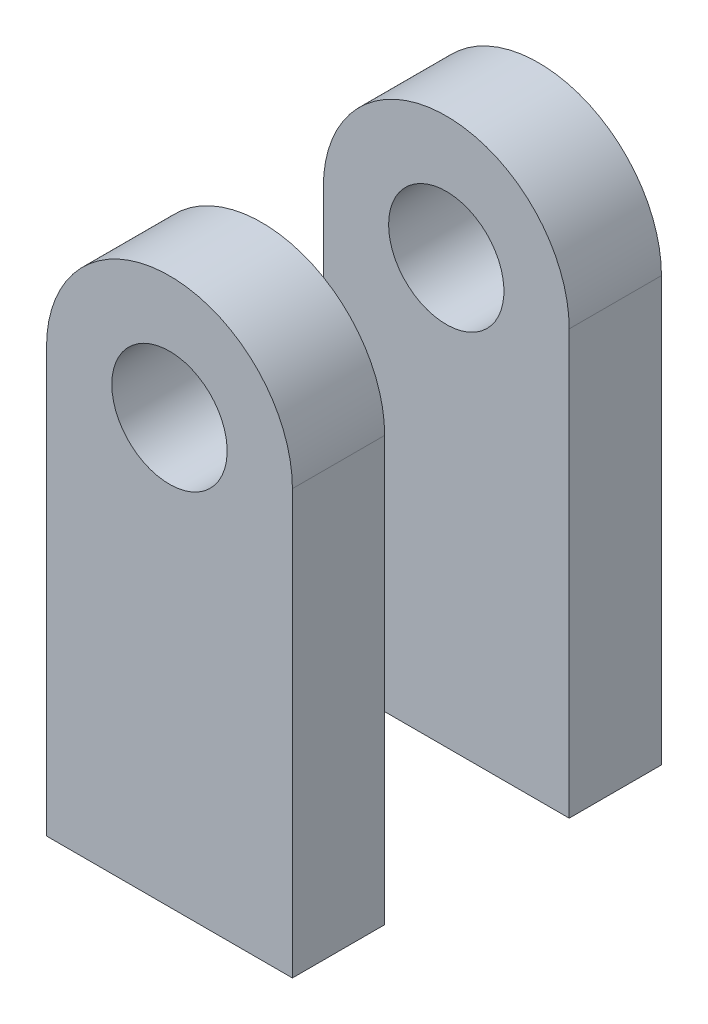
ISO-10303-21;
HEADER;
FILE_DESCRIPTION(('STEP AP214'),'2;1');
FILE_NAME('part.step','',(''),(''),'','','');
FILE_SCHEMA(('AUTOMOTIVE_DESIGN { 1 0 10303 214 1 1 1 1 }'));
ENDSEC;
DATA;
#1=APPLICATION_CONTEXT('core data for automotive mechanical design processes');
#2=APPLICATION_PROTOCOL_DEFINITION('international standard','automotive_design',2000,#1);
#3=PRODUCT_CONTEXT('',#1,'mechanical');
#4=PRODUCT('Part','Part','',(#3));
#5=PRODUCT_RELATED_PRODUCT_CATEGORY('part','',(#4));
#6=PRODUCT_DEFINITION_FORMATION('','',#4);
#7=PRODUCT_DEFINITION_CONTEXT('part definition',#1,'design');
#8=PRODUCT_DEFINITION('design','',#6,#7);
#9=PRODUCT_DEFINITION_SHAPE('','',#8);
#10=(LENGTH_UNIT() NAMED_UNIT(*) SI_UNIT(.MILLI.,.METRE.));
#11=(NAMED_UNIT(*) PLANE_ANGLE_UNIT() SI_UNIT($,.RADIAN.));
#12=(NAMED_UNIT(*) SI_UNIT($,.STERADIAN.) SOLID_ANGLE_UNIT());
#13=UNCERTAINTY_MEASURE_WITH_UNIT(LENGTH_MEASURE(1.E-05),#10,'distance_accuracy_value','');
#14=(GEOMETRIC_REPRESENTATION_CONTEXT(3) GLOBAL_UNCERTAINTY_ASSIGNED_CONTEXT((#13)) GLOBAL_UNIT_ASSIGNED_CONTEXT((#10,
#11,#12)) REPRESENTATION_CONTEXT('',''));
#15=CARTESIAN_POINT('',(0.,0.,0.));
#16=DIRECTION('',(0.,0.,1.));
#17=DIRECTION('',(1.,0.,0.));
#18=AXIS2_PLACEMENT_3D('',#15,#16,#17);
#19=CARTESIAN_POINT('',(5.0766568726894,6.35,7.62));
#20=DIRECTION('',(0.,0.,-1.));
#21=DIRECTION('',(-1.,0.,0.));
#22=AXIS2_PLACEMENT_3D('',#19,#20,#21);
#23=CYLINDRICAL_SURFACE('',#22,5.0766568726894);
#24=CARTESIAN_POINT('',(5.0766568726894,6.35,3.81));
#25=DIRECTION('',(0.,0.,1.));
#26=DIRECTION('',(1.,0.,0.));
#27=AXIS2_PLACEMENT_3D('',#24,#25,#26);
#28=CIRCLE('',#27,5.0766568726894);
#29=CARTESIAN_POINT('',(0.,6.35,3.81));
#30=VERTEX_POINT('',#29);
#31=CARTESIAN_POINT('',(10.1533137453788,6.35,3.81));
#32=VERTEX_POINT('',#31);
#33=EDGE_CURVE('E58',#30,#32,#28,.F.);
#34=ORIENTED_EDGE('',*,*,#33,.F.);
#35=DIRECTION('',(0.,0.,-1.));
#36=VECTOR('',#35,1.);
#37=CARTESIAN_POINT('',(0.,6.35,7.62));
#38=LINE('',#37,#36);
#39=CARTESIAN_POINT('',(0.,6.35,7.62));
#40=VERTEX_POINT('',#39);
#41=EDGE_CURVE('E80',#40,#30,#38,.T.);
#42=ORIENTED_EDGE('',*,*,#41,.F.);
#43=CARTESIAN_POINT('',(5.0766568726894,6.35,7.62));
#44=DIRECTION('',(0.,0.,1.));
#45=DIRECTION('',(1.,0.,0.));
#46=AXIS2_PLACEMENT_3D('',#43,#44,#45);
#47=CIRCLE('',#46,5.0766568726894);
#48=CARTESIAN_POINT('',(10.1533137453788,6.35,7.62));
#49=VERTEX_POINT('',#48);
#50=EDGE_CURVE('E117',#40,#49,#47,.F.);
#51=ORIENTED_EDGE('',*,*,#50,.T.);
#52=DIRECTION('',(0.,0.,-1.));
#53=VECTOR('',#52,1.);
#54=CARTESIAN_POINT('',(10.1533137453788,6.35,7.62));
#55=LINE('',#54,#53);
#56=EDGE_CURVE('E53',#49,#32,#55,.T.);
#57=ORIENTED_EDGE('',*,*,#56,.T.);
#58=EDGE_LOOP('',(#34,#42,#51,#57));
#59=FACE_BOUND('',#58,.T.);
#60=ADVANCED_FACE('F50',(#59),#23,.T.);
#61=CARTESIAN_POINT('',(0.,0.,7.62));
#62=DIRECTION('',(-1.,0.,0.));
#63=DIRECTION('',(0.,0.,1.));
#64=AXIS2_PLACEMENT_3D('',#61,#62,#63);
#65=PLANE('',#64);
#66=DIRECTION('',(0.,1.,0.));
#67=VECTOR('',#66,1.);
#68=CARTESIAN_POINT('',(0.,0.,3.81));
#69=LINE('',#68,#67);
#70=CARTESIAN_POINT('',(0.,-11.15,3.81));
#71=VERTEX_POINT('',#70);
#72=EDGE_CURVE('E12',#71,#30,#69,.T.);
#73=ORIENTED_EDGE('',*,*,#72,.F.);
#74=DIRECTION('',(0.,0.,-1.));
#75=VECTOR('',#74,1.);
#76=CARTESIAN_POINT('',(0.,-11.15,7.62));
#77=LINE('',#76,#75);
#78=CARTESIAN_POINT('',(0.,-11.15,7.62));
#79=VERTEX_POINT('',#78);
#80=EDGE_CURVE('E103',#79,#71,#77,.T.);
#81=ORIENTED_EDGE('',*,*,#80,.F.);
#82=DIRECTION('',(0.,1.,0.));
#83=VECTOR('',#82,1.);
#84=CARTESIAN_POINT('',(0.,0.,7.62));
#85=LINE('',#84,#83);
#86=EDGE_CURVE('E87',#79,#40,#85,.T.);
#87=ORIENTED_EDGE('',*,*,#86,.T.);
#88=ORIENTED_EDGE('',*,*,#41,.T.);
#89=EDGE_LOOP('',(#73,#81,#87,#88));
#90=FACE_BOUND('',#89,.T.);
#91=ADVANCED_FACE('F101',(#90),#65,.T.);
#92=CARTESIAN_POINT('',(5.0766568726894,6.35,7.62));
#93=DIRECTION('',(0.,0.,-1.));
#94=DIRECTION('',(-1.,0.,0.));
#95=AXIS2_PLACEMENT_3D('',#92,#93,#94);
#96=CYLINDRICAL_SURFACE('',#95,2.38125);
#97=CARTESIAN_POINT('',(5.0766568726894,6.35,3.81));
#98=DIRECTION('',(0.,0.,1.));
#99=DIRECTION('',(1.,0.,0.));
#100=AXIS2_PLACEMENT_3D('',#97,#98,#99);
#101=CIRCLE('',#100,2.38125);
#102=CARTESIAN_POINT('',(2.6954068726894,6.35,3.81));
#103=VERTEX_POINT('',#102);
#104=EDGE_CURVE('E121',#103,#103,#101,.T.);
#105=CARTESIAN_POINT('',(5.0766568726894,6.35,7.62));
#106=DIRECTION('',(0.,0.,1.));
#107=DIRECTION('',(1.,0.,0.));
#108=AXIS2_PLACEMENT_3D('',#105,#106,#107);
#109=CIRCLE('',#108,2.38125);
#110=CARTESIAN_POINT('',(2.6954068726894,6.35,7.62));
#111=VERTEX_POINT('',#110);
#112=EDGE_CURVE('E119',#111,#111,#109,.T.);
#113=CARTESIAN_POINT('',(2.6954068726894,6.35,3.81));
#114=CARTESIAN_POINT('',(2.6954068726894,6.35,3.8496875));
#115=CARTESIAN_POINT('',(2.6954068726894,6.35,3.889375));
#116=CARTESIAN_POINT('',(2.6954068726894,6.35,3.96875));
#117=CARTESIAN_POINT('',(2.6954068726894,6.35,4.0084375));
#118=CARTESIAN_POINT('',(2.6954068726894,6.35,4.0878125));
#119=CARTESIAN_POINT('',(2.6954068726894,6.35,4.1275));
#120=CARTESIAN_POINT('',(2.6954068726894,6.35,4.206875));
#121=CARTESIAN_POINT('',(2.6954068726894,6.35,4.2465625));
#122=CARTESIAN_POINT('',(2.6954068726894,6.35,4.3259375));
#123=CARTESIAN_POINT('',(2.6954068726894,6.35,4.365625));
#124=CARTESIAN_POINT('',(2.6954068726894,6.35,4.445));
#125=CARTESIAN_POINT('',(2.6954068726894,6.35,4.4846875));
#126=CARTESIAN_POINT('',(2.6954068726894,6.35,4.5640625));
#127=CARTESIAN_POINT('',(2.6954068726894,6.35,4.60375));
#128=CARTESIAN_POINT('',(2.6954068726894,6.35,4.683125));
#129=CARTESIAN_POINT('',(2.6954068726894,6.35,4.7228125));
#130=CARTESIAN_POINT('',(2.6954068726894,6.35,4.8021875));
#131=CARTESIAN_POINT('',(2.6954068726894,6.35,4.841875));
#132=CARTESIAN_POINT('',(2.6954068726894,6.35,4.92125));
#133=CARTESIAN_POINT('',(2.6954068726894,6.35,4.9609375));
#134=CARTESIAN_POINT('',(2.6954068726894,6.35,5.0403125));
#135=CARTESIAN_POINT('',(2.6954068726894,6.35,5.08));
#136=CARTESIAN_POINT('',(2.6954068726894,6.35,5.159375));
#137=CARTESIAN_POINT('',(2.6954068726894,6.35,5.1990625));
#138=CARTESIAN_POINT('',(2.6954068726894,6.35,5.2784375));
#139=CARTESIAN_POINT('',(2.6954068726894,6.35,5.318125));
#140=CARTESIAN_POINT('',(2.6954068726894,6.35,5.3975));
#141=CARTESIAN_POINT('',(2.6954068726894,6.35,5.4371875));
#142=CARTESIAN_POINT('',(2.6954068726894,6.35,5.5165625));
#143=CARTESIAN_POINT('',(2.6954068726894,6.35,5.55625));
#144=CARTESIAN_POINT('',(2.6954068726894,6.35,5.635625));
#145=CARTESIAN_POINT('',(2.6954068726894,6.35,5.6753125));
#146=CARTESIAN_POINT('',(2.6954068726894,6.35,5.7546875));
#147=CARTESIAN_POINT('',(2.6954068726894,6.35,5.794375));
#148=CARTESIAN_POINT('',(2.6954068726894,6.35,5.87375));
#149=CARTESIAN_POINT('',(2.6954068726894,6.35,5.9134375));
#150=CARTESIAN_POINT('',(2.6954068726894,6.35,5.9928125));
#151=CARTESIAN_POINT('',(2.6954068726894,6.35,6.0325));
#152=CARTESIAN_POINT('',(2.6954068726894,6.35,6.111875));
#153=CARTESIAN_POINT('',(2.6954068726894,6.35,6.1515625));
#154=CARTESIAN_POINT('',(2.6954068726894,6.35,6.2309375));
#155=CARTESIAN_POINT('',(2.6954068726894,6.35,6.270625));
#156=CARTESIAN_POINT('',(2.6954068726894,6.35,6.35));
#157=CARTESIAN_POINT('',(2.6954068726894,6.35,6.3896875));
#158=CARTESIAN_POINT('',(2.6954068726894,6.35,6.4690625));
#159=CARTESIAN_POINT('',(2.6954068726894,6.35,6.50875));
#160=CARTESIAN_POINT('',(2.6954068726894,6.35,6.588125));
#161=CARTESIAN_POINT('',(2.6954068726894,6.35,6.6278125));
#162=CARTESIAN_POINT('',(2.6954068726894,6.35,6.7071875));
#163=CARTESIAN_POINT('',(2.6954068726894,6.35,6.746875));
#164=CARTESIAN_POINT('',(2.6954068726894,6.35,6.82625));
#165=CARTESIAN_POINT('',(2.6954068726894,6.35,6.8659375));
#166=CARTESIAN_POINT('',(2.6954068726894,6.35,6.9453125));
#167=CARTESIAN_POINT('',(2.6954068726894,6.35,6.985));
#168=CARTESIAN_POINT('',(2.6954068726894,6.35,7.064375));
#169=CARTESIAN_POINT('',(2.6954068726894,6.35,7.1040625));
#170=CARTESIAN_POINT('',(2.6954068726894,6.35,7.1834375));
#171=CARTESIAN_POINT('',(2.6954068726894,6.35,7.223125));
#172=CARTESIAN_POINT('',(2.6954068726894,6.35,7.3025));
#173=CARTESIAN_POINT('',(2.6954068726894,6.35,7.3421875));
#174=CARTESIAN_POINT('',(2.6954068726894,6.35,7.4215625));
#175=CARTESIAN_POINT('',(2.6954068726894,6.35,7.46125));
#176=CARTESIAN_POINT('',(2.6954068726894,6.35,7.540625));
#177=CARTESIAN_POINT('',(2.6954068726894,6.35,7.5803125));
#178=CARTESIAN_POINT('',(2.6954068726894,6.35,7.62));
#179=B_SPLINE_CURVE_WITH_KNOTS('',3,(#113,#114,#115,#116,#117,#118,#119,#120,#121,#122,#123,
#124,#125,#126,#127,#128,#129,#130,#131,#132,#133,#134,#135,#136,#137,#138,#139,#140,#141,#142,
#143,#144,#145,#146,#147,#148,#149,#150,#151,#152,#153,#154,#155,#156,#157,#158,#159,#160,#161,
#162,#163,#164,#165,#166,#167,#168,#169,#170,#171,#172,#173,#174,#175,#176,#177,#178),
.UNSPECIFIED.,.F.,.F.,(4,2,2,2,2,2,2,2,2,2,2,2,2,2,2,2,2,2,2,2,2,2,2,2,2,2,2,2,2,2,2,2,4),(0.,
0.1190625,0.238125,0.357187499999999,0.476250000000001,0.5953125,0.714374999999999,0.8334375,
0.9525,1.0715625,1.190625,1.3096875,1.42875,1.5478125,1.666875,1.7859375,1.905,2.0240625,
2.143125,2.2621875,2.38125,2.5003125,2.619375,2.7384375,2.8575,2.9765625,3.095625,3.2146875,
3.33375,3.4528125,3.571875,3.6909375,3.81),.UNSPECIFIED.);
#180=EDGE_CURVE('BSEAM131',#103,#111,#179,.T.);
#181=ORIENTED_EDGE('',*,*,#104,.F.);
#182=ORIENTED_EDGE('',*,*,#112,.T.);
#183=ORIENTED_EDGE('',*,*,#180,.T.);
#184=ORIENTED_EDGE('',*,*,#180,.F.);
#185=EDGE_LOOP('',(#181,#183,#182,#184));
#186=FACE_BOUND('',#185,.T.);
#187=ADVANCED_FACE('F131',(#186),#96,.F.);
#188=CARTESIAN_POINT('',(10.1533137453788,0.,7.62));
#189=DIRECTION('',(-1.,0.,0.));
#190=DIRECTION('',(0.,0.,1.));
#191=AXIS2_PLACEMENT_3D('',#188,#189,#190);
#192=PLANE('',#191);
#193=DIRECTION('',(0.,1.,0.));
#194=VECTOR('',#193,1.);
#195=CARTESIAN_POINT('',(10.1533137453788,0.,7.62));
#196=LINE('',#195,#194);
#197=CARTESIAN_POINT('',(10.1533137453788,-11.15,7.62));
#198=VERTEX_POINT('',#197);
#199=EDGE_CURVE('E94',#198,#49,#196,.T.);
#200=ORIENTED_EDGE('',*,*,#199,.F.);
#201=DIRECTION('',(0.,0.,1.));
#202=VECTOR('',#201,1.);
#203=CARTESIAN_POINT('',(10.1533137453788,-11.15,7.62));
#204=LINE('',#203,#202);
#205=CARTESIAN_POINT('',(10.1533137453788,-11.15,3.81));
#206=VERTEX_POINT('',#205);
#207=EDGE_CURVE('E109',#206,#198,#204,.T.);
#208=ORIENTED_EDGE('',*,*,#207,.F.);
#209=DIRECTION('',(0.,1.,0.));
#210=VECTOR('',#209,1.);
#211=CARTESIAN_POINT('',(10.1533137453788,0.,3.81));
#212=LINE('',#211,#210);
#213=EDGE_CURVE('E107',#206,#32,#212,.T.);
#214=ORIENTED_EDGE('',*,*,#213,.T.);
#215=ORIENTED_EDGE('',*,*,#56,.F.);
#216=EDGE_LOOP('',(#200,#208,#214,#215));
#217=FACE_BOUND('',#216,.T.);
#218=ADVANCED_FACE('F134',(#217),#192,.F.);
#219=CARTESIAN_POINT('',(0.,0.,7.62));
#220=DIRECTION('',(0.,0.,1.));
#221=DIRECTION('',(1.,0.,0.));
#222=AXIS2_PLACEMENT_3D('',#219,#220,#221);
#223=PLANE('',#222);
#224=ORIENTED_EDGE('',*,*,#112,.F.);
#225=EDGE_LOOP('',(#224));
#226=FACE_BOUND('',#225,.T.);
#227=ORIENTED_EDGE('',*,*,#50,.F.);
#228=ORIENTED_EDGE('',*,*,#86,.F.);
#229=DIRECTION('',(-1.,0.,0.));
#230=VECTOR('',#229,1.);
#231=CARTESIAN_POINT('',(0.,-11.15,7.62));
#232=LINE('',#231,#230);
#233=EDGE_CURVE('E112',#198,#79,#232,.T.);
#234=ORIENTED_EDGE('',*,*,#233,.F.);
#235=ORIENTED_EDGE('',*,*,#199,.T.);
#236=EDGE_LOOP('',(#227,#228,#234,#235));
#237=FACE_BOUND('',#236,.T.);
#238=ADVANCED_FACE('F138',(#226,#237),#223,.T.);
#239=CARTESIAN_POINT('',(25.4,0.,3.81));
#240=DIRECTION('',(0.,0.,1.));
#241=DIRECTION('',(1.,0.,0.));
#242=AXIS2_PLACEMENT_3D('',#239,#240,#241);
#243=PLANE('',#242);
#244=ORIENTED_EDGE('',*,*,#104,.T.);
#245=EDGE_LOOP('',(#244));
#246=FACE_BOUND('',#245,.T.);
#247=ORIENTED_EDGE('',*,*,#33,.T.);
#248=ORIENTED_EDGE('',*,*,#213,.F.);
#249=DIRECTION('',(1.,0.,0.));
#250=VECTOR('',#249,1.);
#251=CARTESIAN_POINT('',(0.,-11.15,3.81));
#252=LINE('',#251,#250);
#253=EDGE_CURVE('E105',#71,#206,#252,.T.);
#254=ORIENTED_EDGE('',*,*,#253,.F.);
#255=ORIENTED_EDGE('',*,*,#72,.T.);
#256=EDGE_LOOP('',(#247,#248,#254,#255));
#257=FACE_BOUND('',#256,.T.);
#258=ADVANCED_FACE('F106',(#246,#257),#243,.F.);
#259=CARTESIAN_POINT('',(0.,-11.15,0.));
#260=DIRECTION('',(0.,-1.,0.));
#261=DIRECTION('',(0.,0.,-1.));
#262=AXIS2_PLACEMENT_3D('',#259,#260,#261);
#263=PLANE('',#262);
#264=ORIENTED_EDGE('',*,*,#80,.T.);
#265=ORIENTED_EDGE('',*,*,#253,.T.);
#266=ORIENTED_EDGE('',*,*,#207,.T.);
#267=ORIENTED_EDGE('',*,*,#233,.T.);
#268=EDGE_LOOP('',(#264,#265,#266,#267));
#269=FACE_BOUND('',#268,.T.);
#270=ADVANCED_FACE('F111',(#269),#263,.T.);
#271=CLOSED_SHELL('',(#60,#91,#187,#218,#238,#258,#270));
#272=MANIFOLD_SOLID_BREP('B2',#271);
#273=CARTESIAN_POINT('',(5.0766568726894,6.35,7.62));
#274=DIRECTION('',(0.,0.,-1.));
#275=DIRECTION('',(-1.,0.,0.));
#276=AXIS2_PLACEMENT_3D('',#273,#274,#275);
#277=CYLINDRICAL_SURFACE('',#276,2.38125);
#278=CARTESIAN_POINT('',(5.0766568726894,6.35,-7.62));
#279=DIRECTION('',(0.,0.,1.));
#280=DIRECTION('',(1.,0.,0.));
#281=AXIS2_PLACEMENT_3D('',#278,#279,#280);
#282=CIRCLE('',#281,2.38125);
#283=CARTESIAN_POINT('',(2.6954068726894,6.35,-7.62));
#284=VERTEX_POINT('',#283);
#285=EDGE_CURVE('E288',#284,#284,#282,.T.);
#286=CARTESIAN_POINT('',(5.0766568726894,6.35,-3.81));
#287=DIRECTION('',(0.,0.,1.));
#288=DIRECTION('',(0.,-1.,0.));
#289=AXIS2_PLACEMENT_3D('',#286,#287,#288);
#290=CIRCLE('',#289,2.38125);
#291=CARTESIAN_POINT('',(2.6954068726894,6.35,-3.81));
#292=VERTEX_POINT('',#291);
#293=EDGE_CURVE('E285',#292,#292,#290,.T.);
#294=CARTESIAN_POINT('',(2.6954068726894,6.35,-7.62));
#295=CARTESIAN_POINT('',(2.6954068726894,6.35,-7.5803125));
#296=CARTESIAN_POINT('',(2.6954068726894,6.35,-7.540625));
#297=CARTESIAN_POINT('',(2.6954068726894,6.35,-7.46125));
#298=CARTESIAN_POINT('',(2.6954068726894,6.35,-7.4215625));
#299=CARTESIAN_POINT('',(2.6954068726894,6.35,-7.3421875));
#300=CARTESIAN_POINT('',(2.6954068726894,6.35,-7.3025));
#301=CARTESIAN_POINT('',(2.6954068726894,6.35,-7.223125));
#302=CARTESIAN_POINT('',(2.6954068726894,6.35,-7.1834375));
#303=CARTESIAN_POINT('',(2.6954068726894,6.35,-7.1040625));
#304=CARTESIAN_POINT('',(2.6954068726894,6.35,-7.064375));
#305=CARTESIAN_POINT('',(2.6954068726894,6.35,-6.985));
#306=CARTESIAN_POINT('',(2.6954068726894,6.35,-6.9453125));
#307=CARTESIAN_POINT('',(2.6954068726894,6.35,-6.8659375));
#308=CARTESIAN_POINT('',(2.6954068726894,6.35,-6.82625));
#309=CARTESIAN_POINT('',(2.6954068726894,6.35,-6.746875));
#310=CARTESIAN_POINT('',(2.6954068726894,6.35,-6.7071875));
#311=CARTESIAN_POINT('',(2.6954068726894,6.35,-6.6278125));
#312=CARTESIAN_POINT('',(2.6954068726894,6.35,-6.588125));
#313=CARTESIAN_POINT('',(2.6954068726894,6.35,-6.50875));
#314=CARTESIAN_POINT('',(2.6954068726894,6.35,-6.4690625));
#315=CARTESIAN_POINT('',(2.6954068726894,6.35,-6.3896875));
#316=CARTESIAN_POINT('',(2.6954068726894,6.35,-6.35));
#317=CARTESIAN_POINT('',(2.6954068726894,6.35,-6.270625));
#318=CARTESIAN_POINT('',(2.6954068726894,6.35,-6.2309375));
#319=CARTESIAN_POINT('',(2.6954068726894,6.35,-6.1515625));
#320=CARTESIAN_POINT('',(2.6954068726894,6.35,-6.111875));
#321=CARTESIAN_POINT('',(2.6954068726894,6.35,-6.0325));
#322=CARTESIAN_POINT('',(2.6954068726894,6.35,-5.9928125));
#323=CARTESIAN_POINT('',(2.6954068726894,6.35,-5.9134375));
#324=CARTESIAN_POINT('',(2.6954068726894,6.35,-5.87375));
#325=CARTESIAN_POINT('',(2.6954068726894,6.35,-5.794375));
#326=CARTESIAN_POINT('',(2.6954068726894,6.35,-5.7546875));
#327=CARTESIAN_POINT('',(2.6954068726894,6.35,-5.6753125));
#328=CARTESIAN_POINT('',(2.6954068726894,6.35,-5.635625));
#329=CARTESIAN_POINT('',(2.6954068726894,6.35,-5.55625));
#330=CARTESIAN_POINT('',(2.6954068726894,6.35,-5.5165625));
#331=CARTESIAN_POINT('',(2.6954068726894,6.35,-5.4371875));
#332=CARTESIAN_POINT('',(2.6954068726894,6.35,-5.3975));
#333=CARTESIAN_POINT('',(2.6954068726894,6.35,-5.318125));
#334=CARTESIAN_POINT('',(2.6954068726894,6.35,-5.2784375));
#335=CARTESIAN_POINT('',(2.6954068726894,6.35,-5.1990625));
#336=CARTESIAN_POINT('',(2.6954068726894,6.35,-5.159375));
#337=CARTESIAN_POINT('',(2.6954068726894,6.35,-5.08));
#338=CARTESIAN_POINT('',(2.6954068726894,6.35,-5.0403125));
#339=CARTESIAN_POINT('',(2.6954068726894,6.35,-4.9609375));
#340=CARTESIAN_POINT('',(2.6954068726894,6.35,-4.92125));
#341=CARTESIAN_POINT('',(2.6954068726894,6.35,-4.841875));
#342=CARTESIAN_POINT('',(2.6954068726894,6.35,-4.8021875));
#343=CARTESIAN_POINT('',(2.6954068726894,6.35,-4.7228125));
#344=CARTESIAN_POINT('',(2.6954068726894,6.35,-4.683125));
#345=CARTESIAN_POINT('',(2.6954068726894,6.35,-4.60375));
#346=CARTESIAN_POINT('',(2.6954068726894,6.35,-4.5640625));
#347=CARTESIAN_POINT('',(2.6954068726894,6.35,-4.4846875));
#348=CARTESIAN_POINT('',(2.6954068726894,6.35,-4.445));
#349=CARTESIAN_POINT('',(2.6954068726894,6.35,-4.365625));
#350=CARTESIAN_POINT('',(2.6954068726894,6.35,-4.3259375));
#351=CARTESIAN_POINT('',(2.6954068726894,6.35,-4.2465625));
#352=CARTESIAN_POINT('',(2.6954068726894,6.35,-4.206875));
#353=CARTESIAN_POINT('',(2.6954068726894,6.35,-4.1275));
#354=CARTESIAN_POINT('',(2.6954068726894,6.35,-4.0878125));
#355=CARTESIAN_POINT('',(2.6954068726894,6.35,-4.0084375));
#356=CARTESIAN_POINT('',(2.6954068726894,6.35,-3.96875));
#357=CARTESIAN_POINT('',(2.6954068726894,6.35,-3.889375));
#358=CARTESIAN_POINT('',(2.6954068726894,6.35,-3.8496875));
#359=CARTESIAN_POINT('',(2.6954068726894,6.35,-3.81));
#360=B_SPLINE_CURVE_WITH_KNOTS('',3,(#294,#295,#296,#297,#298,#299,#300,#301,#302,#303,#304,
#305,#306,#307,#308,#309,#310,#311,#312,#313,#314,#315,#316,#317,#318,#319,#320,#321,#322,#323,
#324,#325,#326,#327,#328,#329,#330,#331,#332,#333,#334,#335,#336,#337,#338,#339,#340,#341,#342,
#343,#344,#345,#346,#347,#348,#349,#350,#351,#352,#353,#354,#355,#356,#357,#358,#359),
.UNSPECIFIED.,.F.,.F.,(4,2,2,2,2,2,2,2,2,2,2,2,2,2,2,2,2,2,2,2,2,2,2,2,2,2,2,2,2,2,2,2,4),(0.,
0.119062499999999,0.238125,0.3571875,0.476249999999999,0.5953125,0.714375,0.833437499999999,
0.952499999999998,1.0715625,1.190625,1.3096875,1.42875,1.5478125,1.666875,1.7859375,1.905,
2.0240625,2.143125,2.2621875,2.38125,2.5003125,2.619375,2.7384375,2.8575,2.9765625,3.095625,
3.2146875,3.33375,3.4528125,3.571875,3.6909375,3.81),.UNSPECIFIED.);
#361=EDGE_CURVE('BSEAM220',#284,#292,#360,.T.);
#362=ORIENTED_EDGE('',*,*,#285,.F.);
#363=ORIENTED_EDGE('',*,*,#293,.T.);
#364=ORIENTED_EDGE('',*,*,#361,.T.);
#365=ORIENTED_EDGE('',*,*,#361,.F.);
#366=EDGE_LOOP('',(#362,#364,#363,#365));
#367=FACE_BOUND('',#366,.T.);
#368=ADVANCED_FACE('F220',(#367),#277,.F.);
#369=CARTESIAN_POINT('',(0.,0.,-7.62));
#370=DIRECTION('',(0.,0.,1.));
#371=DIRECTION('',(1.,0.,0.));
#372=AXIS2_PLACEMENT_3D('',#369,#370,#371);
#373=PLANE('',#372);
#374=ORIENTED_EDGE('',*,*,#285,.T.);
#375=EDGE_LOOP('',(#374));
#376=FACE_BOUND('',#375,.T.);
#377=CARTESIAN_POINT('',(5.0766568726894,6.35,-7.62));
#378=DIRECTION('',(0.,0.,1.));
#379=DIRECTION('',(1.,0.,0.));
#380=AXIS2_PLACEMENT_3D('',#377,#378,#379);
#381=CIRCLE('',#380,5.0766568726894);
#382=CARTESIAN_POINT('',(0.,6.35,-7.62));
#383=VERTEX_POINT('',#382);
#384=CARTESIAN_POINT('',(10.1533137453788,6.35,-7.62));
#385=VERTEX_POINT('',#384);
#386=EDGE_CURVE('E291',#383,#385,#381,.F.);
#387=ORIENTED_EDGE('',*,*,#386,.T.);
#388=DIRECTION('',(0.,1.,0.));
#389=VECTOR('',#388,1.);
#390=CARTESIAN_POINT('',(10.1533137453788,0.,-7.62));
#391=LINE('',#390,#389);
#392=CARTESIAN_POINT('',(10.1533137453788,-11.15,-7.62));
#393=VERTEX_POINT('',#392);
#394=EDGE_CURVE('E295',#393,#385,#391,.T.);
#395=ORIENTED_EDGE('',*,*,#394,.F.);
#396=DIRECTION('',(1.,0.,0.));
#397=VECTOR('',#396,1.);
#398=CARTESIAN_POINT('',(0.,-11.15,-7.62));
#399=LINE('',#398,#397);
#400=CARTESIAN_POINT('',(0.,-11.15,-7.62));
#401=VERTEX_POINT('',#400);
#402=EDGE_CURVE('E279',#401,#393,#399,.T.);
#403=ORIENTED_EDGE('',*,*,#402,.F.);
#404=DIRECTION('',(0.,1.,0.));
#405=VECTOR('',#404,1.);
#406=CARTESIAN_POINT('',(0.,0.,-7.62));
#407=LINE('',#406,#405);
#408=EDGE_CURVE('E277',#401,#383,#407,.T.);
#409=ORIENTED_EDGE('',*,*,#408,.T.);
#410=EDGE_LOOP('',(#387,#395,#403,#409));
#411=FACE_BOUND('',#410,.T.);
#412=ADVANCED_FACE('F300',(#376,#411),#373,.F.);
#413=CARTESIAN_POINT('',(10.1533137453788,0.,7.62));
#414=DIRECTION('',(-1.,0.,0.));
#415=DIRECTION('',(0.,0.,1.));
#416=AXIS2_PLACEMENT_3D('',#413,#414,#415);
#417=PLANE('',#416);
#418=DIRECTION('',(0.,1.,0.));
#419=VECTOR('',#418,1.);
#420=CARTESIAN_POINT('',(10.1533137453788,0.,-3.81));
#421=LINE('',#420,#419);
#422=CARTESIAN_POINT('',(10.1533137453788,-11.15,-3.81));
#423=VERTEX_POINT('',#422);
#424=CARTESIAN_POINT('',(10.1533137453788,6.35,-3.81));
#425=VERTEX_POINT('',#424);
#426=EDGE_CURVE('E48',#423,#425,#421,.T.);
#427=ORIENTED_EDGE('',*,*,#426,.F.);
#428=DIRECTION('',(0.,0.,1.));
#429=VECTOR('',#428,1.);
#430=CARTESIAN_POINT('',(10.1533137453788,-11.15,-3.81));
#431=LINE('',#430,#429);
#432=EDGE_CURVE('E273',#393,#423,#431,.T.);
#433=ORIENTED_EDGE('',*,*,#432,.F.);
#434=ORIENTED_EDGE('',*,*,#394,.T.);
#435=DIRECTION('',(0.,0.,-1.));
#436=VECTOR('',#435,1.);
#437=CARTESIAN_POINT('',(10.1533137453788,6.35,7.62));
#438=LINE('',#437,#436);
#439=EDGE_CURVE('E234',#425,#385,#438,.T.);
#440=ORIENTED_EDGE('',*,*,#439,.F.);
#441=EDGE_LOOP('',(#427,#433,#434,#440));
#442=FACE_BOUND('',#441,.T.);
#443=ADVANCED_FACE('F298',(#442),#417,.F.);
#444=CARTESIAN_POINT('',(0.,0.,7.62));
#445=DIRECTION('',(-1.,0.,0.));
#446=DIRECTION('',(0.,0.,1.));
#447=AXIS2_PLACEMENT_3D('',#444,#445,#446);
#448=PLANE('',#447);
#449=ORIENTED_EDGE('',*,*,#408,.F.);
#450=DIRECTION('',(0.,0.,-1.));
#451=VECTOR('',#450,1.);
#452=CARTESIAN_POINT('',(0.,-11.15,-3.81));
#453=LINE('',#452,#451);
#454=CARTESIAN_POINT('',(0.,-11.15,-3.81));
#455=VERTEX_POINT('',#454);
#456=EDGE_CURVE('E265',#455,#401,#453,.T.);
#457=ORIENTED_EDGE('',*,*,#456,.F.);
#458=DIRECTION('',(0.,1.,0.));
#459=VECTOR('',#458,1.);
#460=CARTESIAN_POINT('',(0.,0.,-3.81));
#461=LINE('',#460,#459);
#462=CARTESIAN_POINT('',(0.,6.35,-3.81));
#463=VERTEX_POINT('',#462);
#464=EDGE_CURVE('E259',#455,#463,#461,.T.);
#465=ORIENTED_EDGE('',*,*,#464,.T.);
#466=DIRECTION('',(0.,0.,-1.));
#467=VECTOR('',#466,1.);
#468=CARTESIAN_POINT('',(0.,6.35,7.62));
#469=LINE('',#468,#467);
#470=EDGE_CURVE('E227',#463,#383,#469,.T.);
#471=ORIENTED_EDGE('',*,*,#470,.T.);
#472=EDGE_LOOP('',(#449,#457,#465,#471));
#473=FACE_BOUND('',#472,.T.);
#474=ADVANCED_FACE('F275',(#473),#448,.T.);
#475=CARTESIAN_POINT('',(5.0766568726894,6.35,7.62));
#476=DIRECTION('',(0.,0.,-1.));
#477=DIRECTION('',(-1.,0.,0.));
#478=AXIS2_PLACEMENT_3D('',#475,#476,#477);
#479=CYLINDRICAL_SURFACE('',#478,5.0766568726894);
#480=ORIENTED_EDGE('',*,*,#470,.F.);
#481=CARTESIAN_POINT('',(5.0766568726894,6.35,-3.81));
#482=DIRECTION('',(0.,0.,1.));
#483=DIRECTION('',(0.,-1.,0.));
#484=AXIS2_PLACEMENT_3D('',#481,#482,#483);
#485=CIRCLE('',#484,5.0766568726894);
#486=EDGE_CURVE('E263',#463,#425,#485,.F.);
#487=ORIENTED_EDGE('',*,*,#486,.T.);
#488=ORIENTED_EDGE('',*,*,#439,.T.);
#489=ORIENTED_EDGE('',*,*,#386,.F.);
#490=EDGE_LOOP('',(#480,#487,#488,#489));
#491=FACE_BOUND('',#490,.T.);
#492=ADVANCED_FACE('F301',(#491),#479,.T.);
#493=CARTESIAN_POINT('',(25.4,0.,-3.81));
#494=DIRECTION('',(0.,0.,1.));
#495=DIRECTION('',(0.,-1.,0.));
#496=AXIS2_PLACEMENT_3D('',#493,#494,#495);
#497=PLANE('',#496);
#498=ORIENTED_EDGE('',*,*,#293,.F.);
#499=EDGE_LOOP('',(#498));
#500=FACE_BOUND('',#499,.T.);
#501=ORIENTED_EDGE('',*,*,#464,.F.);
#502=DIRECTION('',(-1.,0.,0.));
#503=VECTOR('',#502,1.);
#504=CARTESIAN_POINT('',(0.,-11.15,-3.81));
#505=LINE('',#504,#503);
#506=EDGE_CURVE('E262',#423,#455,#505,.T.);
#507=ORIENTED_EDGE('',*,*,#506,.F.);
#508=ORIENTED_EDGE('',*,*,#426,.T.);
#509=ORIENTED_EDGE('',*,*,#486,.F.);
#510=EDGE_LOOP('',(#501,#507,#508,#509));
#511=FACE_BOUND('',#510,.T.);
#512=ADVANCED_FACE('F261',(#500,#511),#497,.T.);
#513=CARTESIAN_POINT('',(0.,-11.15,0.));
#514=DIRECTION('',(0.,-1.,0.));
#515=DIRECTION('',(0.,0.,-1.));
#516=AXIS2_PLACEMENT_3D('',#513,#514,#515);
#517=PLANE('',#516);
#518=ORIENTED_EDGE('',*,*,#456,.T.);
#519=ORIENTED_EDGE('',*,*,#402,.T.);
#520=ORIENTED_EDGE('',*,*,#432,.T.);
#521=ORIENTED_EDGE('',*,*,#506,.T.);
#522=EDGE_LOOP('',(#518,#519,#520,#521));
#523=FACE_BOUND('',#522,.T.);
#524=ADVANCED_FACE('F270',(#523),#517,.T.);
#525=CLOSED_SHELL('',(#368,#412,#443,#474,#492,#512,#524));
#526=MANIFOLD_SOLID_BREP('B6',#525);
#527=ADVANCED_BREP_SHAPE_REPRESENTATION('',(#18,#272,#526),#14);
#528=SHAPE_DEFINITION_REPRESENTATION(#9,#527);
ENDSEC;
END-ISO-10303-21;
